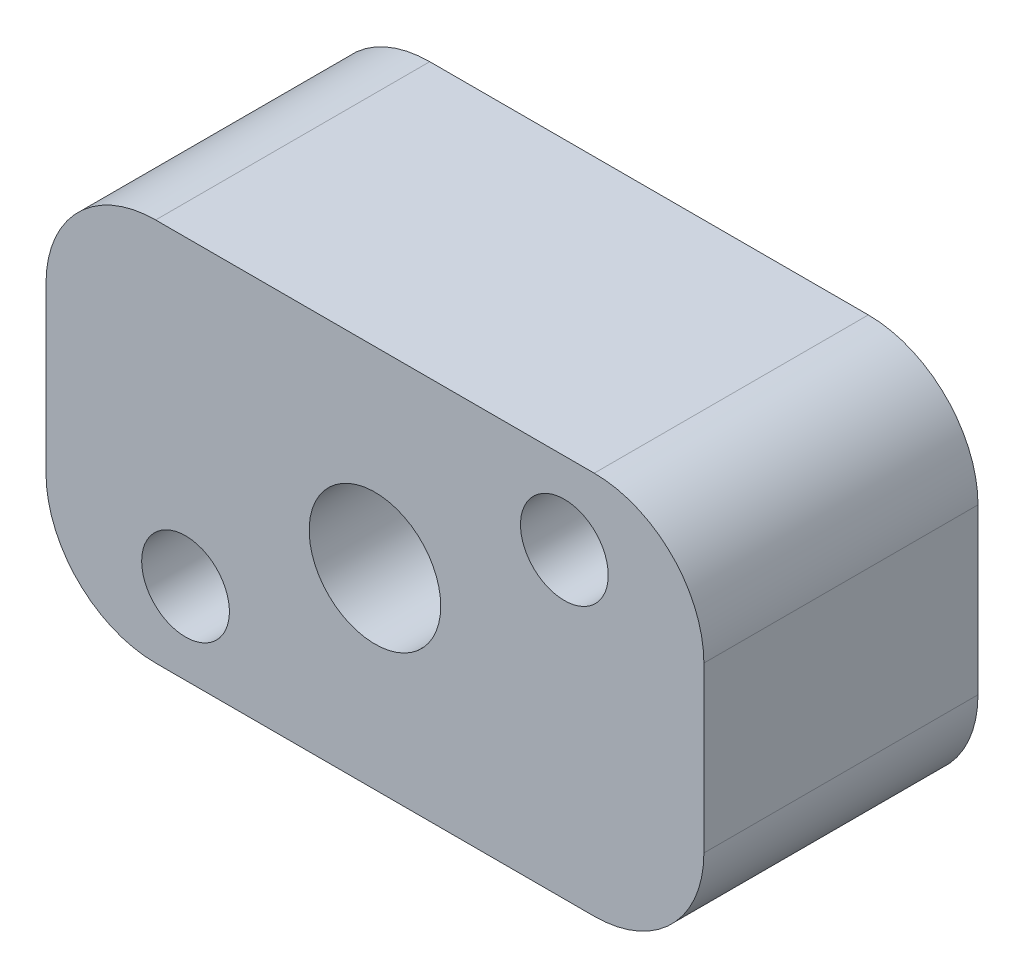
ISO-10303-21;
HEADER;
FILE_DESCRIPTION(('STEP AP214'),'2;1');
FILE_NAME('part.step','',(''),(''),'','','');
FILE_SCHEMA(('AUTOMOTIVE_DESIGN { 1 0 10303 214 1 1 1 1 }'));
ENDSEC;
DATA;
#1=APPLICATION_CONTEXT('core data for automotive mechanical design processes');
#2=APPLICATION_PROTOCOL_DEFINITION('international standard','automotive_design',2000,#1);
#3=PRODUCT_CONTEXT('',#1,'mechanical');
#4=PRODUCT('Part','Part','',(#3));
#5=PRODUCT_RELATED_PRODUCT_CATEGORY('part','',(#4));
#6=PRODUCT_DEFINITION_FORMATION('','',#4);
#7=PRODUCT_DEFINITION_CONTEXT('part definition',#1,'design');
#8=PRODUCT_DEFINITION('design','',#6,#7);
#9=PRODUCT_DEFINITION_SHAPE('','',#8);
#10=(LENGTH_UNIT() NAMED_UNIT(*) SI_UNIT(.MILLI.,.METRE.));
#11=(NAMED_UNIT(*) PLANE_ANGLE_UNIT() SI_UNIT($,.RADIAN.));
#12=(NAMED_UNIT(*) SI_UNIT($,.STERADIAN.) SOLID_ANGLE_UNIT());
#13=UNCERTAINTY_MEASURE_WITH_UNIT(LENGTH_MEASURE(1.E-05),#10,'distance_accuracy_value','');
#14=(GEOMETRIC_REPRESENTATION_CONTEXT(3) GLOBAL_UNCERTAINTY_ASSIGNED_CONTEXT((#13)) GLOBAL_UNIT_ASSIGNED_CONTEXT((#10,
#11,#12)) REPRESENTATION_CONTEXT('',''));
#15=CARTESIAN_POINT('',(0.,0.,0.));
#16=DIRECTION('',(0.,0.,1.));
#17=DIRECTION('',(1.,0.,0.));
#18=AXIS2_PLACEMENT_3D('',#15,#16,#17);
#19=CARTESIAN_POINT('',(0.,0.,25.));
#20=DIRECTION('',(0.,0.,-1.));
#21=DIRECTION('',(-1.,0.,0.));
#22=AXIS2_PLACEMENT_3D('',#19,#20,#21);
#23=PLANE('',#22);
#24=DIRECTION('',(1.,0.,0.));
#25=VECTOR('',#24,1.);
#26=CARTESIAN_POINT('',(0.,0.,25.));
#27=LINE('',#26,#25);
#28=CARTESIAN_POINT('',(10.,0.,25.));
#29=VERTEX_POINT('',#28);
#30=CARTESIAN_POINT('',(50.,0.,25.));
#31=VERTEX_POINT('',#30);
#32=EDGE_CURVE('E169',#29,#31,#27,.T.);
#33=ORIENTED_EDGE('',*,*,#32,.T.);
#34=CARTESIAN_POINT('',(50.,10.,25.));
#35=DIRECTION('',(0.,0.,-1.));
#36=DIRECTION('',(-1.,0.,0.));
#37=AXIS2_PLACEMENT_3D('',#34,#35,#36);
#38=CIRCLE('',#37,10.);
#39=CARTESIAN_POINT('',(60.,10.,25.));
#40=VERTEX_POINT('',#39);
#41=EDGE_CURVE('E147',#31,#40,#38,.F.);
#42=ORIENTED_EDGE('',*,*,#41,.T.);
#43=DIRECTION('',(0.,1.,0.));
#44=VECTOR('',#43,1.);
#45=CARTESIAN_POINT('',(60.,0.,25.));
#46=LINE('',#45,#44);
#47=CARTESIAN_POINT('',(60.,25.,25.));
#48=VERTEX_POINT('',#47);
#49=EDGE_CURVE('E117',#40,#48,#46,.T.);
#50=ORIENTED_EDGE('',*,*,#49,.T.);
#51=CARTESIAN_POINT('',(50.,25.,25.));
#52=DIRECTION('',(0.,0.,-1.));
#53=DIRECTION('',(-1.,0.,0.));
#54=AXIS2_PLACEMENT_3D('',#51,#52,#53);
#55=CIRCLE('',#54,10.);
#56=CARTESIAN_POINT('',(50.,35.,25.));
#57=VERTEX_POINT('',#56);
#58=EDGE_CURVE('E53',#48,#57,#55,.F.);
#59=ORIENTED_EDGE('',*,*,#58,.T.);
#60=DIRECTION('',(-1.,0.,0.));
#61=VECTOR('',#60,1.);
#62=CARTESIAN_POINT('',(0.,35.,25.));
#63=LINE('',#62,#61);
#64=CARTESIAN_POINT('',(10.,35.,25.));
#65=VERTEX_POINT('',#64);
#66=EDGE_CURVE('E133',#57,#65,#63,.T.);
#67=ORIENTED_EDGE('',*,*,#66,.T.);
#68=CARTESIAN_POINT('',(10.,25.,25.));
#69=DIRECTION('',(0.,0.,-1.));
#70=DIRECTION('',(-1.,0.,0.));
#71=AXIS2_PLACEMENT_3D('',#68,#69,#70);
#72=CIRCLE('',#71,10.);
#73=CARTESIAN_POINT('',(0.,25.,25.));
#74=VERTEX_POINT('',#73);
#75=EDGE_CURVE('E143',#65,#74,#72,.F.);
#76=ORIENTED_EDGE('',*,*,#75,.T.);
#77=DIRECTION('',(0.,-1.,0.));
#78=VECTOR('',#77,1.);
#79=CARTESIAN_POINT('',(0.,0.,25.));
#80=LINE('',#79,#78);
#81=CARTESIAN_POINT('',(0.,10.,25.));
#82=VERTEX_POINT('',#81);
#83=EDGE_CURVE('E127',#74,#82,#80,.T.);
#84=ORIENTED_EDGE('',*,*,#83,.T.);
#85=CARTESIAN_POINT('',(10.,10.,25.));
#86=DIRECTION('',(0.,0.,-1.));
#87=DIRECTION('',(-1.,0.,0.));
#88=AXIS2_PLACEMENT_3D('',#85,#86,#87);
#89=CIRCLE('',#88,10.);
#90=EDGE_CURVE('E145',#82,#29,#89,.F.);
#91=ORIENTED_EDGE('',*,*,#90,.T.);
#92=EDGE_LOOP('',(#33,#42,#50,#59,#67,#76,#84,#91));
#93=FACE_BOUND('',#92,.T.);
#94=CARTESIAN_POINT('',(30.,17.5,25.));
#95=DIRECTION('',(0.,0.,1.));
#96=DIRECTION('',(1.,0.,0.));
#97=AXIS2_PLACEMENT_3D('',#94,#95,#96);
#98=CIRCLE('',#97,6.);
#99=CARTESIAN_POINT('',(36.,17.5,25.));
#100=VERTEX_POINT('',#99);
#101=EDGE_CURVE('E178',#100,#100,#98,.T.);
#102=ORIENTED_EDGE('',*,*,#101,.F.);
#103=EDGE_LOOP('',(#102));
#104=FACE_BOUND('',#103,.T.);
#105=CARTESIAN_POINT('',(47.2755780179687,27.5774205104817,25.));
#106=DIRECTION('',(0.,0.,1.));
#107=DIRECTION('',(1.,0.,0.));
#108=AXIS2_PLACEMENT_3D('',#105,#106,#107);
#109=CIRCLE('',#108,4.);
#110=CARTESIAN_POINT('',(51.2755780179687,27.5774205104817,25.));
#111=VERTEX_POINT('',#110);
#112=EDGE_CURVE('E183',#111,#111,#109,.T.);
#113=ORIENTED_EDGE('',*,*,#112,.F.);
#114=EDGE_LOOP('',(#113));
#115=FACE_BOUND('',#114,.T.);
#116=CARTESIAN_POINT('',(12.7244219820313,7.42257948951826,25.));
#117=DIRECTION('',(0.,0.,1.));
#118=DIRECTION('',(-1.,0.,0.));
#119=AXIS2_PLACEMENT_3D('',#116,#117,#118);
#120=CIRCLE('',#119,4.);
#121=CARTESIAN_POINT('',(8.72442198203133,7.42257948951826,25.));
#122=VERTEX_POINT('',#121);
#123=EDGE_CURVE('E188',#122,#122,#120,.T.);
#124=ORIENTED_EDGE('',*,*,#123,.F.);
#125=EDGE_LOOP('',(#124));
#126=FACE_BOUND('',#125,.T.);
#127=ADVANCED_FACE('F33',(#93,#104,#115,#126),#23,.F.);
#128=CARTESIAN_POINT('',(0.,0.,0.));
#129=DIRECTION('',(0.,0.,-1.));
#130=DIRECTION('',(-1.,0.,0.));
#131=AXIS2_PLACEMENT_3D('',#128,#129,#130);
#132=PLANE('',#131);
#133=CARTESIAN_POINT('',(47.2755780179687,27.5774205104817,0.));
#134=DIRECTION('',(0.,0.,1.));
#135=DIRECTION('',(1.,0.,0.));
#136=AXIS2_PLACEMENT_3D('',#133,#134,#135);
#137=CIRCLE('',#136,4.);
#138=CARTESIAN_POINT('',(51.2755780179687,27.5774205104817,0.));
#139=VERTEX_POINT('',#138);
#140=EDGE_CURVE('E185',#139,#139,#137,.T.);
#141=ORIENTED_EDGE('',*,*,#140,.T.);
#142=EDGE_LOOP('',(#141));
#143=FACE_BOUND('',#142,.T.);
#144=DIRECTION('',(0.,1.,0.));
#145=VECTOR('',#144,1.);
#146=CARTESIAN_POINT('',(60.,0.,0.));
#147=LINE('',#146,#145);
#148=CARTESIAN_POINT('',(60.,10.,0.));
#149=VERTEX_POINT('',#148);
#150=CARTESIAN_POINT('',(60.,25.,0.));
#151=VERTEX_POINT('',#150);
#152=EDGE_CURVE('E115',#149,#151,#147,.T.);
#153=ORIENTED_EDGE('',*,*,#152,.F.);
#154=CARTESIAN_POINT('',(50.,10.,0.));
#155=DIRECTION('',(0.,0.,-1.));
#156=DIRECTION('',(-1.,0.,0.));
#157=AXIS2_PLACEMENT_3D('',#154,#155,#156);
#158=CIRCLE('',#157,10.);
#159=CARTESIAN_POINT('',(50.,0.,0.));
#160=VERTEX_POINT('',#159);
#161=EDGE_CURVE('E98',#149,#160,#158,.T.);
#162=ORIENTED_EDGE('',*,*,#161,.T.);
#163=DIRECTION('',(1.,0.,0.));
#164=VECTOR('',#163,1.);
#165=CARTESIAN_POINT('',(0.,0.,0.));
#166=LINE('',#165,#164);
#167=CARTESIAN_POINT('',(10.,0.,0.));
#168=VERTEX_POINT('',#167);
#169=EDGE_CURVE('E125',#168,#160,#166,.T.);
#170=ORIENTED_EDGE('',*,*,#169,.F.);
#171=CARTESIAN_POINT('',(10.,10.,0.));
#172=DIRECTION('',(0.,0.,-1.));
#173=DIRECTION('',(-1.,0.,0.));
#174=AXIS2_PLACEMENT_3D('',#171,#172,#173);
#175=CIRCLE('',#174,10.);
#176=CARTESIAN_POINT('',(0.,10.,0.));
#177=VERTEX_POINT('',#176);
#178=EDGE_CURVE('E109',#168,#177,#175,.T.);
#179=ORIENTED_EDGE('',*,*,#178,.T.);
#180=DIRECTION('',(0.,-1.,0.));
#181=VECTOR('',#180,1.);
#182=CARTESIAN_POINT('',(0.,0.,0.));
#183=LINE('',#182,#181);
#184=CARTESIAN_POINT('',(0.,25.,0.));
#185=VERTEX_POINT('',#184);
#186=EDGE_CURVE('E129',#185,#177,#183,.T.);
#187=ORIENTED_EDGE('',*,*,#186,.F.);
#188=CARTESIAN_POINT('',(10.,25.,0.));
#189=DIRECTION('',(0.,0.,-1.));
#190=DIRECTION('',(-1.,0.,0.));
#191=AXIS2_PLACEMENT_3D('',#188,#189,#190);
#192=CIRCLE('',#191,10.);
#193=CARTESIAN_POINT('',(10.,35.,0.));
#194=VERTEX_POINT('',#193);
#195=EDGE_CURVE('E136',#185,#194,#192,.T.);
#196=ORIENTED_EDGE('',*,*,#195,.T.);
#197=DIRECTION('',(-1.,0.,0.));
#198=VECTOR('',#197,1.);
#199=CARTESIAN_POINT('',(0.,35.,0.));
#200=LINE('',#199,#198);
#201=CARTESIAN_POINT('',(50.,35.,0.));
#202=VERTEX_POINT('',#201);
#203=EDGE_CURVE('E124',#202,#194,#200,.T.);
#204=ORIENTED_EDGE('',*,*,#203,.F.);
#205=CARTESIAN_POINT('',(50.,25.,0.));
#206=DIRECTION('',(0.,0.,-1.));
#207=DIRECTION('',(-1.,0.,0.));
#208=AXIS2_PLACEMENT_3D('',#205,#206,#207);
#209=CIRCLE('',#208,10.);
#210=EDGE_CURVE('E118',#202,#151,#209,.T.);
#211=ORIENTED_EDGE('',*,*,#210,.T.);
#212=EDGE_LOOP('',(#153,#162,#170,#179,#187,#196,#204,#211));
#213=FACE_BOUND('',#212,.T.);
#214=CARTESIAN_POINT('',(30.,17.5,0.));
#215=DIRECTION('',(0.,0.,1.));
#216=DIRECTION('',(1.,0.,0.));
#217=AXIS2_PLACEMENT_3D('',#214,#215,#216);
#218=CIRCLE('',#217,6.);
#219=CARTESIAN_POINT('',(36.,17.5,0.));
#220=VERTEX_POINT('',#219);
#221=EDGE_CURVE('E174',#220,#220,#218,.T.);
#222=ORIENTED_EDGE('',*,*,#221,.T.);
#223=EDGE_LOOP('',(#222));
#224=FACE_BOUND('',#223,.T.);
#225=CARTESIAN_POINT('',(12.7244219820313,7.42257948951826,0.));
#226=DIRECTION('',(0.,0.,1.));
#227=DIRECTION('',(-1.,0.,0.));
#228=AXIS2_PLACEMENT_3D('',#225,#226,#227);
#229=CIRCLE('',#228,4.);
#230=CARTESIAN_POINT('',(8.72442198203133,7.42257948951826,0.));
#231=VERTEX_POINT('',#230);
#232=EDGE_CURVE('E191',#231,#231,#229,.T.);
#233=ORIENTED_EDGE('',*,*,#232,.T.);
#234=EDGE_LOOP('',(#233));
#235=FACE_BOUND('',#234,.T.);
#236=ADVANCED_FACE('F121',(#143,#213,#224,#235),#132,.T.);
#237=CARTESIAN_POINT('',(0.,0.,25.));
#238=DIRECTION('',(1.,0.,0.));
#239=DIRECTION('',(0.,0.,-1.));
#240=AXIS2_PLACEMENT_3D('',#237,#238,#239);
#241=PLANE('',#240);
#242=ORIENTED_EDGE('',*,*,#186,.T.);
#243=DIRECTION('',(0.,0.,-1.));
#244=VECTOR('',#243,1.);
#245=CARTESIAN_POINT('',(0.,10.,25.));
#246=LINE('',#245,#244);
#247=EDGE_CURVE('E152',#177,#82,#246,.F.);
#248=ORIENTED_EDGE('',*,*,#247,.T.);
#249=ORIENTED_EDGE('',*,*,#83,.F.);
#250=DIRECTION('',(0.,0.,-1.));
#251=VECTOR('',#250,1.);
#252=CARTESIAN_POINT('',(0.,25.,25.));
#253=LINE('',#252,#251);
#254=EDGE_CURVE('E149',#74,#185,#253,.T.);
#255=ORIENTED_EDGE('',*,*,#254,.T.);
#256=EDGE_LOOP('',(#242,#248,#249,#255));
#257=FACE_BOUND('',#256,.T.);
#258=ADVANCED_FACE('F165',(#257),#241,.F.);
#259=CARTESIAN_POINT('',(0.,0.,25.));
#260=DIRECTION('',(0.,1.,0.));
#261=DIRECTION('',(0.,0.,1.));
#262=AXIS2_PLACEMENT_3D('',#259,#260,#261);
#263=PLANE('',#262);
#264=ORIENTED_EDGE('',*,*,#169,.T.);
#265=DIRECTION('',(0.,0.,-1.));
#266=VECTOR('',#265,1.);
#267=CARTESIAN_POINT('',(50.,0.,25.));
#268=LINE('',#267,#266);
#269=EDGE_CURVE('E103',#160,#31,#268,.F.);
#270=ORIENTED_EDGE('',*,*,#269,.T.);
#271=ORIENTED_EDGE('',*,*,#32,.F.);
#272=DIRECTION('',(0.,0.,-1.));
#273=VECTOR('',#272,1.);
#274=CARTESIAN_POINT('',(10.,0.,25.));
#275=LINE('',#274,#273);
#276=EDGE_CURVE('E108',#29,#168,#275,.T.);
#277=ORIENTED_EDGE('',*,*,#276,.T.);
#278=EDGE_LOOP('',(#264,#270,#271,#277));
#279=FACE_BOUND('',#278,.T.);
#280=ADVANCED_FACE('F217',(#279),#263,.F.);
#281=CARTESIAN_POINT('',(60.,0.,25.));
#282=DIRECTION('',(-1.,0.,0.));
#283=DIRECTION('',(0.,0.,1.));
#284=AXIS2_PLACEMENT_3D('',#281,#282,#283);
#285=PLANE('',#284);
#286=ORIENTED_EDGE('',*,*,#49,.F.);
#287=DIRECTION('',(0.,0.,-1.));
#288=VECTOR('',#287,1.);
#289=CARTESIAN_POINT('',(60.,10.,25.));
#290=LINE('',#289,#288);
#291=EDGE_CURVE('E102',#40,#149,#290,.T.);
#292=ORIENTED_EDGE('',*,*,#291,.T.);
#293=ORIENTED_EDGE('',*,*,#152,.T.);
#294=DIRECTION('',(0.,0.,-1.));
#295=VECTOR('',#294,1.);
#296=CARTESIAN_POINT('',(60.,25.,25.));
#297=LINE('',#296,#295);
#298=EDGE_CURVE('E119',#151,#48,#297,.F.);
#299=ORIENTED_EDGE('',*,*,#298,.T.);
#300=EDGE_LOOP('',(#286,#292,#293,#299));
#301=FACE_BOUND('',#300,.T.);
#302=ADVANCED_FACE('F114',(#301),#285,.F.);
#303=CARTESIAN_POINT('',(0.,35.,25.));
#304=DIRECTION('',(0.,-1.,0.));
#305=DIRECTION('',(0.,0.,-1.));
#306=AXIS2_PLACEMENT_3D('',#303,#304,#305);
#307=PLANE('',#306);
#308=ORIENTED_EDGE('',*,*,#203,.T.);
#309=DIRECTION('',(0.,0.,-1.));
#310=VECTOR('',#309,1.);
#311=CARTESIAN_POINT('',(10.,35.,25.));
#312=LINE('',#311,#310);
#313=EDGE_CURVE('E11',#194,#65,#312,.F.);
#314=ORIENTED_EDGE('',*,*,#313,.T.);
#315=ORIENTED_EDGE('',*,*,#66,.F.);
#316=DIRECTION('',(0.,0.,-1.));
#317=VECTOR('',#316,1.);
#318=CARTESIAN_POINT('',(50.,35.,25.));
#319=LINE('',#318,#317);
#320=EDGE_CURVE('E41',#57,#202,#319,.T.);
#321=ORIENTED_EDGE('',*,*,#320,.T.);
#322=EDGE_LOOP('',(#308,#314,#315,#321));
#323=FACE_BOUND('',#322,.T.);
#324=ADVANCED_FACE('F155',(#323),#307,.F.);
#325=CARTESIAN_POINT('',(30.,17.5,25.));
#326=DIRECTION('',(0.,0.,-1.));
#327=DIRECTION('',(-1.,0.,0.));
#328=AXIS2_PLACEMENT_3D('',#325,#326,#327);
#329=CYLINDRICAL_SURFACE('',#328,6.);
#330=ORIENTED_EDGE('',*,*,#101,.T.);
#331=EDGE_LOOP('',(#330));
#332=FACE_BOUND('',#331,.T.);
#333=ORIENTED_EDGE('',*,*,#221,.F.);
#334=EDGE_LOOP('',(#333));
#335=FACE_BOUND('',#334,.T.);
#336=ADVANCED_FACE('F210',(#332,#335),#329,.F.);
#337=CARTESIAN_POINT('',(47.2755780179687,27.5774205104817,25.));
#338=DIRECTION('',(0.,0.,-1.));
#339=DIRECTION('',(-1.,0.,0.));
#340=AXIS2_PLACEMENT_3D('',#337,#338,#339);
#341=CYLINDRICAL_SURFACE('',#340,4.);
#342=ORIENTED_EDGE('',*,*,#112,.T.);
#343=EDGE_LOOP('',(#342));
#344=FACE_BOUND('',#343,.T.);
#345=ORIENTED_EDGE('',*,*,#140,.F.);
#346=EDGE_LOOP('',(#345));
#347=FACE_BOUND('',#346,.T.);
#348=ADVANCED_FACE('F298',(#344,#347),#341,.F.);
#349=CARTESIAN_POINT('',(12.7244219820313,7.42257948951826,25.));
#350=DIRECTION('',(0.,0.,-1.));
#351=DIRECTION('',(-1.,0.,0.));
#352=AXIS2_PLACEMENT_3D('',#349,#350,#351);
#353=CYLINDRICAL_SURFACE('',#352,4.);
#354=ORIENTED_EDGE('',*,*,#123,.T.);
#355=EDGE_LOOP('',(#354));
#356=FACE_BOUND('',#355,.T.);
#357=ORIENTED_EDGE('',*,*,#232,.F.);
#358=EDGE_LOOP('',(#357));
#359=FACE_BOUND('',#358,.T.);
#360=ADVANCED_FACE('F197',(#356,#359),#353,.F.);
#361=CARTESIAN_POINT('',(50.,10.,25.));
#362=DIRECTION('',(0.,0.,-1.));
#363=DIRECTION('',(-1.,0.,0.));
#364=AXIS2_PLACEMENT_3D('',#361,#362,#363);
#365=CYLINDRICAL_SURFACE('',#364,10.);
#366=ORIENTED_EDGE('',*,*,#41,.F.);
#367=ORIENTED_EDGE('',*,*,#269,.F.);
#368=ORIENTED_EDGE('',*,*,#161,.F.);
#369=ORIENTED_EDGE('',*,*,#291,.F.);
#370=EDGE_LOOP('',(#366,#367,#368,#369));
#371=FACE_BOUND('',#370,.T.);
#372=ADVANCED_FACE('F101',(#371),#365,.T.);
#373=CARTESIAN_POINT('',(10.,10.,25.));
#374=DIRECTION('',(0.,0.,-1.));
#375=DIRECTION('',(-1.,0.,0.));
#376=AXIS2_PLACEMENT_3D('',#373,#374,#375);
#377=CYLINDRICAL_SURFACE('',#376,10.);
#378=ORIENTED_EDGE('',*,*,#90,.F.);
#379=ORIENTED_EDGE('',*,*,#247,.F.);
#380=ORIENTED_EDGE('',*,*,#178,.F.);
#381=ORIENTED_EDGE('',*,*,#276,.F.);
#382=EDGE_LOOP('',(#378,#379,#380,#381));
#383=FACE_BOUND('',#382,.T.);
#384=ADVANCED_FACE('F225',(#383),#377,.T.);
#385=CARTESIAN_POINT('',(10.,25.,25.));
#386=DIRECTION('',(0.,0.,-1.));
#387=DIRECTION('',(-1.,0.,0.));
#388=AXIS2_PLACEMENT_3D('',#385,#386,#387);
#389=CYLINDRICAL_SURFACE('',#388,10.);
#390=ORIENTED_EDGE('',*,*,#75,.F.);
#391=ORIENTED_EDGE('',*,*,#313,.F.);
#392=ORIENTED_EDGE('',*,*,#195,.F.);
#393=ORIENTED_EDGE('',*,*,#254,.F.);
#394=EDGE_LOOP('',(#390,#391,#392,#393));
#395=FACE_BOUND('',#394,.T.);
#396=ADVANCED_FACE('F162',(#395),#389,.T.);
#397=CARTESIAN_POINT('',(50.,25.,25.));
#398=DIRECTION('',(0.,0.,-1.));
#399=DIRECTION('',(-1.,0.,0.));
#400=AXIS2_PLACEMENT_3D('',#397,#398,#399);
#401=CYLINDRICAL_SURFACE('',#400,10.);
#402=ORIENTED_EDGE('',*,*,#58,.F.);
#403=ORIENTED_EDGE('',*,*,#298,.F.);
#404=ORIENTED_EDGE('',*,*,#210,.F.);
#405=ORIENTED_EDGE('',*,*,#320,.F.);
#406=EDGE_LOOP('',(#402,#403,#404,#405));
#407=FACE_BOUND('',#406,.T.);
#408=ADVANCED_FACE('F35',(#407),#401,.T.);
#409=CLOSED_SHELL('',(#127,#236,#258,#280,#302,#324,#336,#348,#360,#372,#384,#396,#408));
#410=MANIFOLD_SOLID_BREP('B2',#409);
#411=ADVANCED_BREP_SHAPE_REPRESENTATION('',(#18,#410),#14);
#412=SHAPE_DEFINITION_REPRESENTATION(#9,#411);
ENDSEC;
END-ISO-10303-21;
